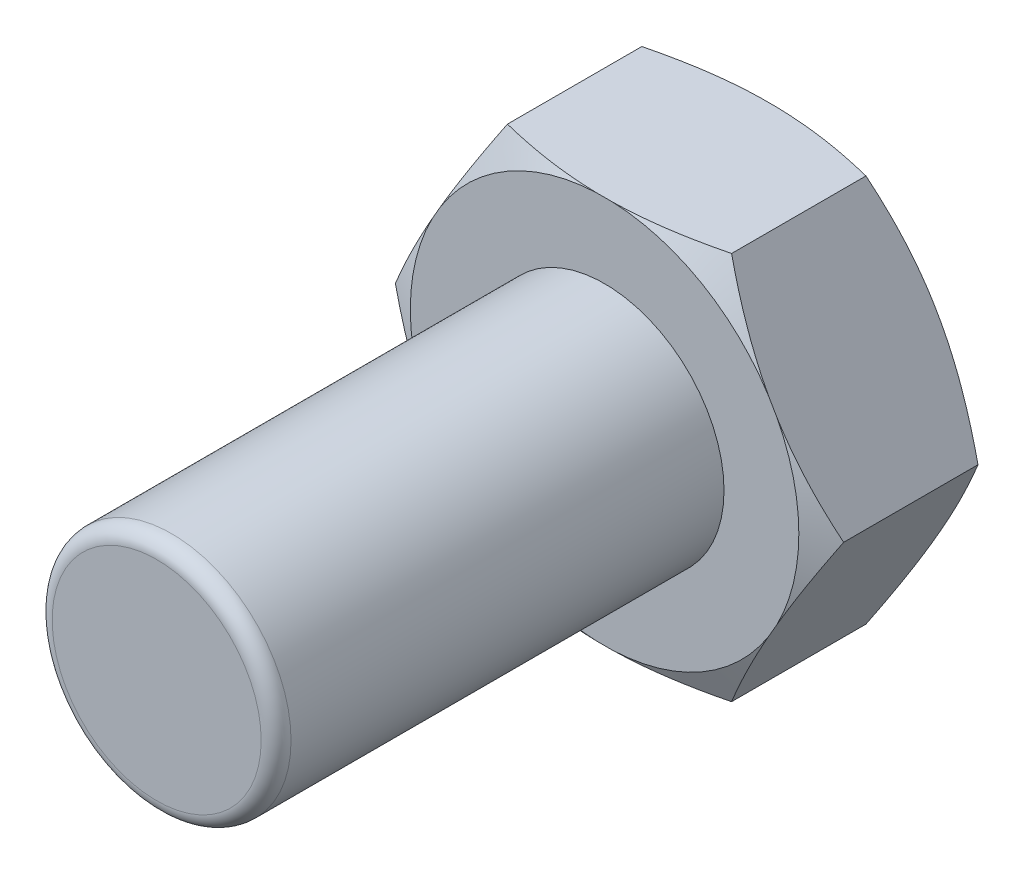
ISO-10303-21;
HEADER;
FILE_DESCRIPTION(('STEP AP214'),'2;1');
FILE_NAME('part.step','',(''),(''),'','','');
FILE_SCHEMA(('AUTOMOTIVE_DESIGN { 1 0 10303 214 1 1 1 1 }'));
ENDSEC;
DATA;
#1=APPLICATION_CONTEXT('core data for automotive mechanical design processes');
#2=APPLICATION_PROTOCOL_DEFINITION('international standard','automotive_design',2000,#1);
#3=PRODUCT_CONTEXT('',#1,'mechanical');
#4=PRODUCT('Part','Part','',(#3));
#5=PRODUCT_RELATED_PRODUCT_CATEGORY('part','',(#4));
#6=PRODUCT_DEFINITION_FORMATION('','',#4);
#7=PRODUCT_DEFINITION_CONTEXT('part definition',#1,'design');
#8=PRODUCT_DEFINITION('design','',#6,#7);
#9=PRODUCT_DEFINITION_SHAPE('','',#8);
#10=(LENGTH_UNIT() NAMED_UNIT(*) SI_UNIT(.MILLI.,.METRE.));
#11=(NAMED_UNIT(*) PLANE_ANGLE_UNIT() SI_UNIT($,.RADIAN.));
#12=(NAMED_UNIT(*) SI_UNIT($,.STERADIAN.) SOLID_ANGLE_UNIT());
#13=UNCERTAINTY_MEASURE_WITH_UNIT(LENGTH_MEASURE(1.E-05),#10,'distance_accuracy_value','');
#14=(GEOMETRIC_REPRESENTATION_CONTEXT(3) GLOBAL_UNCERTAINTY_ASSIGNED_CONTEXT((#13)) GLOBAL_UNIT_ASSIGNED_CONTEXT((#10,
#11,#12)) REPRESENTATION_CONTEXT('',''));
#15=CARTESIAN_POINT('',(0.,0.,0.));
#16=DIRECTION('',(0.,0.,1.));
#17=DIRECTION('',(1.,0.,0.));
#18=AXIS2_PLACEMENT_3D('',#15,#16,#17);
#19=CARTESIAN_POINT('',(0.,0.,5.5));
#20=DIRECTION('',(0.,0.,1.));
#21=DIRECTION('',(1.,0.,0.));
#22=AXIS2_PLACEMENT_3D('',#19,#20,#21);
#23=PLANE('',#22);
#24=CARTESIAN_POINT('',(0.,0.,5.5));
#25=DIRECTION('',(0.,0.,1.));
#26=DIRECTION('',(1.,0.,0.));
#27=AXIS2_PLACEMENT_3D('',#24,#25,#26);
#28=CIRCLE('',#27,4.);
#29=CARTESIAN_POINT('',(4.,0.,5.5));
#30=VERTEX_POINT('',#29);
#31=EDGE_CURVE('E219',#30,#30,#28,.T.);
#32=ORIENTED_EDGE('',*,*,#31,.F.);
#33=EDGE_LOOP('',(#32));
#34=FACE_BOUND('',#33,.T.);
#35=CARTESIAN_POINT('',(0.,0.,5.5));
#36=DIRECTION('',(0.,0.,1.));
#37=DIRECTION('',(1.,0.,0.));
#38=AXIS2_PLACEMENT_3D('',#35,#36,#37);
#39=CIRCLE('',#38,6.50555349946514);
#40=CARTESIAN_POINT('',(5.49479033678218,-3.48274395975477,5.5));
#41=VERTEX_POINT('',#40);
#42=CARTESIAN_POINT('',(0.268749575633286,-6.5,5.5));
#43=VERTEX_POINT('',#42);
#44=EDGE_CURVE('E226',#41,#43,#39,.F.);
#45=ORIENTED_EDGE('',*,*,#44,.F.);
#46=DIRECTION('',(0.5,0.866025403784439,0.));
#47=VECTOR('',#46,1.);
#48=CARTESIAN_POINT('',(3.75277674973257,-6.5,5.5));
#49=LINE('',#48,#47);
#50=CARTESIAN_POINT('',(5.76353991241553,-3.01725604024523,5.5));
#51=VERTEX_POINT('',#50);
#52=EDGE_CURVE('E202',#41,#51,#49,.T.);
#53=ORIENTED_EDGE('',*,*,#52,.T.);
#54=CARTESIAN_POINT('',(5.76353991241553,3.01725604024522,5.5));
#55=VERTEX_POINT('',#54);
#56=EDGE_CURVE('E224',#55,#51,#39,.F.);
#57=ORIENTED_EDGE('',*,*,#56,.F.);
#58=DIRECTION('',(-0.5,0.866025403784439,0.));
#59=VECTOR('',#58,1.);
#60=CARTESIAN_POINT('',(7.50555349946513,0.,5.5));
#61=LINE('',#60,#59);
#62=CARTESIAN_POINT('',(5.49479033678217,3.48274395975478,5.5));
#63=VERTEX_POINT('',#62);
#64=EDGE_CURVE('E257',#55,#63,#61,.T.);
#65=ORIENTED_EDGE('',*,*,#64,.T.);
#66=CARTESIAN_POINT('',(0.268749575633261,6.5,5.5));
#67=VERTEX_POINT('',#66);
#68=EDGE_CURVE('E225',#67,#63,#39,.F.);
#69=ORIENTED_EDGE('',*,*,#68,.F.);
#70=DIRECTION('',(-1.,0.,0.));
#71=VECTOR('',#70,1.);
#72=CARTESIAN_POINT('',(3.75277674973256,6.5,5.5));
#73=LINE('',#72,#71);
#74=CARTESIAN_POINT('',(-0.268749575633261,6.5,5.5));
#75=VERTEX_POINT('',#74);
#76=EDGE_CURVE('E263',#67,#75,#73,.T.);
#77=ORIENTED_EDGE('',*,*,#76,.T.);
#78=CARTESIAN_POINT('',(-5.4947903367822,3.48274395975472,5.5));
#79=VERTEX_POINT('',#78);
#80=EDGE_CURVE('E236',#79,#75,#39,.F.);
#81=ORIENTED_EDGE('',*,*,#80,.F.);
#82=DIRECTION('',(-0.5,-0.866025403784439,0.));
#83=VECTOR('',#82,1.);
#84=CARTESIAN_POINT('',(-3.75277674973257,6.5,5.5));
#85=LINE('',#84,#83);
#86=CARTESIAN_POINT('',(-5.7635399124155,3.01725604024527,5.5));
#87=VERTEX_POINT('',#86);
#88=EDGE_CURVE('E265',#79,#87,#85,.T.);
#89=ORIENTED_EDGE('',*,*,#88,.T.);
#90=CARTESIAN_POINT('',(-5.76353991241548,-3.01725604024531,5.5));
#91=VERTEX_POINT('',#90);
#92=EDGE_CURVE('E234',#91,#87,#39,.F.);
#93=ORIENTED_EDGE('',*,*,#92,.F.);
#94=DIRECTION('',(0.5,-0.866025403784438,0.));
#95=VECTOR('',#94,1.);
#96=CARTESIAN_POINT('',(-7.50555349946514,0.,5.5));
#97=LINE('',#96,#95);
#98=CARTESIAN_POINT('',(-5.49479033678222,-3.48274395975469,5.5));
#99=VERTEX_POINT('',#98);
#100=EDGE_CURVE('E272',#91,#99,#97,.T.);
#101=ORIENTED_EDGE('',*,*,#100,.T.);
#102=CARTESIAN_POINT('',(-0.268749575633286,-6.5,5.5));
#103=VERTEX_POINT('',#102);
#104=EDGE_CURVE('E230',#103,#99,#39,.F.);
#105=ORIENTED_EDGE('',*,*,#104,.F.);
#106=DIRECTION('',(1.,0.,0.));
#107=VECTOR('',#106,1.);
#108=CARTESIAN_POINT('',(-3.75277674973257,-6.5,5.5));
#109=LINE('',#108,#107);
#110=EDGE_CURVE('E207',#103,#43,#109,.T.);
#111=ORIENTED_EDGE('',*,*,#110,.T.);
#112=EDGE_LOOP('',(#45,#53,#57,#65,#69,#77,#81,#89,#93,#101,#105,#111));
#113=FACE_BOUND('',#112,.T.);
#114=ADVANCED_FACE('F38',(#34,#113),#23,.T.);
#115=CARTESIAN_POINT('',(0.,0.,0.));
#116=DIRECTION('',(0.,0.,1.));
#117=DIRECTION('',(1.,0.,0.));
#118=AXIS2_PLACEMENT_3D('',#115,#116,#117);
#119=PLANE('',#118);
#120=DIRECTION('',(0.5,0.866025403784439,0.));
#121=VECTOR('',#120,1.);
#122=CARTESIAN_POINT('',(3.75277674973257,-6.5,0.));
#123=LINE('',#122,#121);
#124=CARTESIAN_POINT('',(5.49479033678218,-3.48274395975477,0.));
#125=VERTEX_POINT('',#124);
#126=CARTESIAN_POINT('',(5.76353991241553,-3.01725604024523,0.));
#127=VERTEX_POINT('',#126);
#128=EDGE_CURVE('E277',#125,#127,#123,.T.);
#129=ORIENTED_EDGE('',*,*,#128,.F.);
#130=CARTESIAN_POINT('',(0.,0.,0.));
#131=DIRECTION('',(0.,0.,1.));
#132=DIRECTION('',(1.,0.,0.));
#133=AXIS2_PLACEMENT_3D('',#130,#131,#132);
#134=CIRCLE('',#133,6.50555349946514);
#135=CARTESIAN_POINT('',(0.268749575633286,-6.5,0.));
#136=VERTEX_POINT('',#135);
#137=EDGE_CURVE('E223',#125,#136,#134,.F.);
#138=ORIENTED_EDGE('',*,*,#137,.T.);
#139=DIRECTION('',(1.,0.,0.));
#140=VECTOR('',#139,1.);
#141=CARTESIAN_POINT('',(-3.75277674973257,-6.5,0.));
#142=LINE('',#141,#140);
#143=CARTESIAN_POINT('',(-0.268749575633286,-6.5,0.));
#144=VERTEX_POINT('',#143);
#145=EDGE_CURVE('E194',#144,#136,#142,.T.);
#146=ORIENTED_EDGE('',*,*,#145,.F.);
#147=CARTESIAN_POINT('',(-5.49479033678222,-3.48274395975469,0.));
#148=VERTEX_POINT('',#147);
#149=EDGE_CURVE('E595',#144,#148,#134,.F.);
#150=ORIENTED_EDGE('',*,*,#149,.T.);
#151=DIRECTION('',(0.5,-0.866025403784438,0.));
#152=VECTOR('',#151,1.);
#153=CARTESIAN_POINT('',(-7.50555349946514,0.,0.));
#154=LINE('',#153,#152);
#155=CARTESIAN_POINT('',(-5.76353991241548,-3.01725604024531,0.));
#156=VERTEX_POINT('',#155);
#157=EDGE_CURVE('E190',#156,#148,#154,.T.);
#158=ORIENTED_EDGE('',*,*,#157,.F.);
#159=CARTESIAN_POINT('',(-5.7635399124155,3.01725604024527,0.));
#160=VERTEX_POINT('',#159);
#161=EDGE_CURVE('E172',#156,#160,#134,.F.);
#162=ORIENTED_EDGE('',*,*,#161,.T.);
#163=DIRECTION('',(-0.5,-0.866025403784439,0.));
#164=VECTOR('',#163,1.);
#165=CARTESIAN_POINT('',(-3.75277674973257,6.5,0.));
#166=LINE('',#165,#164);
#167=CARTESIAN_POINT('',(-5.4947903367822,3.48274395975472,0.));
#168=VERTEX_POINT('',#167);
#169=EDGE_CURVE('E180',#168,#160,#166,.T.);
#170=ORIENTED_EDGE('',*,*,#169,.F.);
#171=CARTESIAN_POINT('',(-0.268749575633261,6.5,0.));
#172=VERTEX_POINT('',#171);
#173=EDGE_CURVE('E162',#168,#172,#134,.F.);
#174=ORIENTED_EDGE('',*,*,#173,.T.);
#175=DIRECTION('',(-1.,0.,0.));
#176=VECTOR('',#175,1.);
#177=CARTESIAN_POINT('',(3.75277674973256,6.5,0.));
#178=LINE('',#177,#176);
#179=CARTESIAN_POINT('',(0.268749575633261,6.5,0.));
#180=VERTEX_POINT('',#179);
#181=EDGE_CURVE('E191',#180,#172,#178,.T.);
#182=ORIENTED_EDGE('',*,*,#181,.F.);
#183=CARTESIAN_POINT('',(5.49479033678217,3.48274395975478,0.));
#184=VERTEX_POINT('',#183);
#185=EDGE_CURVE('E173',#180,#184,#134,.F.);
#186=ORIENTED_EDGE('',*,*,#185,.T.);
#187=DIRECTION('',(-0.5,0.866025403784439,0.));
#188=VECTOR('',#187,1.);
#189=CARTESIAN_POINT('',(7.50555349946513,0.,0.));
#190=LINE('',#189,#188);
#191=CARTESIAN_POINT('',(5.76353991241553,3.01725604024522,0.));
#192=VERTEX_POINT('',#191);
#193=EDGE_CURVE('E196',#192,#184,#190,.T.);
#194=ORIENTED_EDGE('',*,*,#193,.F.);
#195=EDGE_CURVE('E220',#192,#127,#134,.F.);
#196=ORIENTED_EDGE('',*,*,#195,.T.);
#197=EDGE_LOOP('',(#129,#138,#146,#150,#158,#162,#170,#174,#182,#186,#194,#196));
#198=FACE_BOUND('',#197,.T.);
#199=ADVANCED_FACE('F188',(#198),#119,.F.);
#200=CARTESIAN_POINT('',(3.75277674973257,-6.5,5.5));
#201=DIRECTION('',(-0.866025403784439,0.5,0.));
#202=DIRECTION('',(-0.5,-0.866025403784439,0.));
#203=AXIS2_PLACEMENT_3D('',#200,#201,#202);
#204=PLANE('',#203);
#205=DIRECTION('',(0.,0.,-1.));
#206=VECTOR('',#205,1.);
#207=CARTESIAN_POINT('',(3.75277674973257,-6.5,5.5));
#208=LINE('',#207,#206);
#209=CARTESIAN_POINT('',(3.75277674973257,-6.5,5.));
#210=VERTEX_POINT('',#209);
#211=CARTESIAN_POINT('',(3.75277674973257,-6.5,0.5));
#212=VERTEX_POINT('',#211);
#213=EDGE_CURVE('E203',#210,#212,#208,.T.);
#214=ORIENTED_EDGE('',*,*,#213,.T.);
#215=CARTESIAN_POINT('',(3.75237260454413,-6.5007,0.500202088914585));
#216=CARTESIAN_POINT('',(3.8581513468533,-6.3174858439598,0.447308100414797));
#217=CARTESIAN_POINT('',(3.96434221026252,-6.13355787323541,0.397552458642436));
#218=CARTESIAN_POINT('',(4.17756983432187,-5.76423679478743,0.305365614830753));
#219=CARTESIAN_POINT('',(4.28460700117574,-5.57884298349829,0.262938185371068));
#220=CARTESIAN_POINT('',(4.49959934134498,-5.20646532708704,0.186455410870334));
#221=CARTESIAN_POINT('',(4.60755563959989,-5.01947953351247,0.152412559968943));
#222=CARTESIAN_POINT('',(4.82409838792355,-4.6444164914053,0.0938297029314832));
#223=CARTESIAN_POINT('',(4.93268472608622,-4.4563394366997,0.0692880586741505));
#224=CARTESIAN_POINT('',(5.1478553862202,-4.0836529210495,0.031003092263815));
#225=CARTESIAN_POINT('',(5.25442927124948,-3.89906153741879,0.0170275284853245));
#226=CARTESIAN_POINT('',(5.4677990566594,-3.52949422828874,-0.000510400439065489));
#227=CARTESIAN_POINT('',(5.57459496772756,-3.34451828427808,-0.00407225212184421));
#228=CARTESIAN_POINT('',(5.78802860217816,-2.97484038536555,-0.000644602363145451));
#229=CARTESIAN_POINT('',(5.8946663719813,-2.79013835006069,0.00633352888495326));
#230=CARTESIAN_POINT('',(6.10763808623,-2.42126052040688,0.0305511734218139));
#231=CARTESIAN_POINT('',(6.21397205579703,-2.23708468254632,0.0477898120447853));
#232=CARTESIAN_POINT('',(6.41948815126255,-1.88112036342686,0.0905216057624534));
#233=CARTESIAN_POINT('',(6.5187011062663,-1.70927848459131,0.11543017165032));
#234=CARTESIAN_POINT('',(6.71656951926134,-1.36656034007088,0.173005823171236));
#235=CARTESIAN_POINT('',(6.81522491642766,-1.19568417973793,0.205673739175031));
#236=CARTESIAN_POINT('',(7.01298812041286,-0.853148262567952,0.278357612028755));
#237=CARTESIAN_POINT('',(7.11208869539026,-0.681501031647809,0.318451480294036));
#238=CARTESIAN_POINT('',(7.30956235262323,-0.339466624163873,0.404867578606761));
#239=CARTESIAN_POINT('',(7.40793575289547,-0.169078896779033,0.451186892347521));
#240=CARTESIAN_POINT('',(7.50595764465357,0.000700000000001562,0.500202088914583));
#241=B_SPLINE_CURVE_WITH_KNOTS('',3,(#215,#216,#217,#218,#219,#220,#221,#222,#223,#224,#225,
#226,#227,#228,#229,#230,#231,#232,#233,#234,#235,#236,#237,#238,#239,#240),.UNSPECIFIED.,.F.,
.F.,(4,2,2,2,2,2,2,2,2,2,2,2,4),(0.,0.654242187553569,1.30882018300877,1.96436776438002,
2.61980227114733,3.26037426611438,3.90097784487654,4.54089085456767,5.18074932213415,
5.78053406899308,6.38038303105972,6.98692412571604,7.59318207044967),.UNSPECIFIED.);
#242=EDGE_CURVE('E335',#212,#125,#241,.T.);
#243=ORIENTED_EDGE('',*,*,#242,.T.);
#244=ORIENTED_EDGE('',*,*,#128,.T.);
#245=CARTESIAN_POINT('',(7.50555349946514,0.,0.5));
#246=VERTEX_POINT('',#245);
#247=EDGE_CURVE('E602',#127,#246,#241,.T.);
#248=ORIENTED_EDGE('',*,*,#247,.T.);
#249=DIRECTION('',(0.,0.,-1.));
#250=VECTOR('',#249,1.);
#251=CARTESIAN_POINT('',(7.50555349946513,0.,5.5));
#252=LINE('',#251,#250);
#253=CARTESIAN_POINT('',(7.50555349946514,0.,5.));
#254=VERTEX_POINT('',#253);
#255=EDGE_CURVE('E217',#254,#246,#252,.T.);
#256=ORIENTED_EDGE('',*,*,#255,.F.);
#257=CARTESIAN_POINT('',(7.50595764465357,0.000700000000001858,4.99979791108542));
#258=CARTESIAN_POINT('',(7.4001789023444,-0.182514156040201,5.0526918995852));
#259=CARTESIAN_POINT('',(7.29398803893518,-0.366442126764588,5.10244754135756));
#260=CARTESIAN_POINT('',(7.08076041487583,-0.735763205212568,5.19463438516925));
#261=CARTESIAN_POINT('',(6.97372324802196,-0.921157016501705,5.23706181462893));
#262=CARTESIAN_POINT('',(6.75873090785272,-1.29353467291295,5.31354458912967));
#263=CARTESIAN_POINT('',(6.65077460959781,-1.48052046648752,5.34758744003106));
#264=CARTESIAN_POINT('',(6.43423186127415,-1.8555835085947,5.40617029706852));
#265=CARTESIAN_POINT('',(6.32564552311148,-2.0436605633003,5.43071194132585));
#266=CARTESIAN_POINT('',(6.1104748629775,-2.41634707895049,5.46899690773619));
#267=CARTESIAN_POINT('',(6.00390097794822,-2.6009384625812,5.48297247151467));
#268=CARTESIAN_POINT('',(5.7905311925383,-2.97050577171125,5.50051040043907));
#269=CARTESIAN_POINT('',(5.68373528147015,-3.15548171572191,5.50407225212184));
#270=CARTESIAN_POINT('',(5.47030164701954,-3.52515961463445,5.50064460236315));
#271=CARTESIAN_POINT('',(5.36366387721641,-3.70986164993931,5.49366647111505));
#272=CARTESIAN_POINT('',(5.1506921629677,-4.07873947959311,5.46944882657819));
#273=CARTESIAN_POINT('',(5.04435819340067,-4.26291531745367,5.45221018795521));
#274=CARTESIAN_POINT('',(4.83884209793515,-4.61887963657314,5.40947839423755));
#275=CARTESIAN_POINT('',(4.7396291429314,-4.79072151540868,5.38456982834968));
#276=CARTESIAN_POINT('',(4.54176072993636,-5.13343965992911,5.32699417682876));
#277=CARTESIAN_POINT('',(4.44310533277004,-5.30431582026207,5.29432626082497));
#278=CARTESIAN_POINT('',(4.24534212878484,-5.64685173743205,5.22164238797124));
#279=CARTESIAN_POINT('',(4.14624155380744,-5.81849896835219,5.18154851970596));
#280=CARTESIAN_POINT('',(3.94876789657447,-6.16053337583612,5.09513242139324));
#281=CARTESIAN_POINT('',(3.85039449630223,-6.33092110322097,5.04881310765248));
#282=CARTESIAN_POINT('',(3.75237260454413,-6.5007,4.99979791108542));
#283=B_SPLINE_CURVE_WITH_KNOTS('',3,(#257,#258,#259,#260,#261,#262,#263,#264,#265,#266,#267,
#268,#269,#270,#271,#272,#273,#274,#275,#276,#277,#278,#279,#280,#281,#282),.UNSPECIFIED.,.F.,
.F.,(4,2,2,2,2,2,2,2,2,2,2,2,4),(0.,0.654242187553568,1.30882018300877,1.96436776438002,
2.61980227114733,3.26037426611438,3.90097784487653,4.54089085456766,5.18074932213414,
5.78053406899307,6.38038303105972,6.98692412571604,7.59318207044967),.UNSPECIFIED.);
#284=EDGE_CURVE('E279',#254,#51,#283,.T.);
#285=ORIENTED_EDGE('',*,*,#284,.T.);
#286=ORIENTED_EDGE('',*,*,#52,.F.);
#287=EDGE_CURVE('E371',#41,#210,#283,.T.);
#288=ORIENTED_EDGE('',*,*,#287,.T.);
#289=EDGE_LOOP('',(#214,#243,#244,#248,#256,#285,#286,#288));
#290=FACE_BOUND('',#289,.T.);
#291=ADVANCED_FACE('F384',(#290),#204,.F.);
#292=CARTESIAN_POINT('',(7.50555349946513,0.,5.5));
#293=DIRECTION('',(-0.866025403784439,-0.5,0.));
#294=DIRECTION('',(0.5,-0.866025403784439,0.));
#295=AXIS2_PLACEMENT_3D('',#292,#293,#294);
#296=PLANE('',#295);
#297=ORIENTED_EDGE('',*,*,#255,.T.);
#298=CARTESIAN_POINT('',(7.50595764465356,-0.00069999999999797,0.500202088914583));
#299=CARTESIAN_POINT('',(7.4001789023444,0.182514156040205,0.447308100414796));
#300=CARTESIAN_POINT('',(7.29398803893518,0.366442126764592,0.397552458642435));
#301=CARTESIAN_POINT('',(7.08076041487583,0.735763205212573,0.305365614830752));
#302=CARTESIAN_POINT('',(6.97372324802196,0.921157016501709,0.262938185371066));
#303=CARTESIAN_POINT('',(6.75873090785272,1.29353467291296,0.186455410870333));
#304=CARTESIAN_POINT('',(6.65077460959781,1.48052046648753,0.152412559968942));
#305=CARTESIAN_POINT('',(6.43423186127415,1.85558350859471,0.0938297029314831));
#306=CARTESIAN_POINT('',(6.32564552311148,2.0436605633003,0.0692880586741502));
#307=CARTESIAN_POINT('',(6.1104748629775,2.4163470789505,0.0310030922638145));
#308=CARTESIAN_POINT('',(6.00390097794822,2.60093846258121,0.0170275284853243));
#309=CARTESIAN_POINT('',(5.7905311925383,2.97050577171126,-0.000510400439065394));
#310=CARTESIAN_POINT('',(5.68373528147014,3.15548171572192,-0.00407225212184394));
#311=CARTESIAN_POINT('',(5.47030164701954,3.52515961463445,-0.000644602363145258));
#312=CARTESIAN_POINT('',(5.3636638772164,3.70986164993931,0.00633352888495324));
#313=CARTESIAN_POINT('',(5.15069216296769,4.07873947959312,0.0305511734218142));
#314=CARTESIAN_POINT('',(5.04435819340067,4.26291531745368,0.0477898120447861));
#315=CARTESIAN_POINT('',(4.83884209793515,4.61887963657314,0.0905216057624544));
#316=CARTESIAN_POINT('',(4.7396291429314,4.79072151540869,0.115430171650321));
#317=CARTESIAN_POINT('',(4.54176072993636,5.13343965992912,0.173005823171237));
#318=CARTESIAN_POINT('',(4.44310533277004,5.30431582026207,0.205673739175032));
#319=CARTESIAN_POINT('',(4.24534212878483,5.64685173743205,0.278357612028756));
#320=CARTESIAN_POINT('',(4.14624155380744,5.81849896835219,0.318451480294037));
#321=CARTESIAN_POINT('',(3.94876789657447,6.16053337583613,0.404867578606762));
#322=CARTESIAN_POINT('',(3.85039449630223,6.33092110322097,0.451186892347522));
#323=CARTESIAN_POINT('',(3.75237260454413,6.5007,0.500202088914585));
#324=B_SPLINE_CURVE_WITH_KNOTS('',3,(#298,#299,#300,#301,#302,#303,#304,#305,#306,#307,#308,
#309,#310,#311,#312,#313,#314,#315,#316,#317,#318,#319,#320,#321,#322,#323),.UNSPECIFIED.,.F.,
.F.,(4,2,2,2,2,2,2,2,2,2,2,2,4),(0.,0.654242187553569,1.30882018300877,1.96436776438002,
2.61980227114733,3.26037426611438,3.90097784487654,4.54089085456767,5.18074932213415,
5.78053406899307,6.38038303105972,6.98692412571604,7.59318207044967),.UNSPECIFIED.);
#325=EDGE_CURVE('E284',#246,#192,#324,.T.);
#326=ORIENTED_EDGE('',*,*,#325,.T.);
#327=ORIENTED_EDGE('',*,*,#193,.T.);
#328=CARTESIAN_POINT('',(3.75277674973257,6.5,0.5));
#329=VERTEX_POINT('',#328);
#330=EDGE_CURVE('E283',#184,#329,#324,.T.);
#331=ORIENTED_EDGE('',*,*,#330,.T.);
#332=DIRECTION('',(0.,0.,-1.));
#333=VECTOR('',#332,1.);
#334=CARTESIAN_POINT('',(3.75277674973256,6.5,5.5));
#335=LINE('',#334,#333);
#336=CARTESIAN_POINT('',(3.75277674973257,6.5,5.));
#337=VERTEX_POINT('',#336);
#338=EDGE_CURVE('E214',#337,#329,#335,.T.);
#339=ORIENTED_EDGE('',*,*,#338,.F.);
#340=CARTESIAN_POINT('',(3.75237260454413,6.5007,4.99979791108542));
#341=CARTESIAN_POINT('',(3.85815134685329,6.3174858439598,5.0526918995852));
#342=CARTESIAN_POINT('',(3.96434221026252,6.13355787323541,5.10244754135756));
#343=CARTESIAN_POINT('',(4.17756983432187,5.76423679478743,5.19463438516925));
#344=CARTESIAN_POINT('',(4.28460700117574,5.57884298349829,5.23706181462893));
#345=CARTESIAN_POINT('',(4.49959934134498,5.20646532708704,5.31354458912967));
#346=CARTESIAN_POINT('',(4.60755563959989,5.01947953351247,5.34758744003106));
#347=CARTESIAN_POINT('',(4.82409838792355,4.6444164914053,5.40617029706852));
#348=CARTESIAN_POINT('',(4.93268472608622,4.4563394366997,5.43071194132585));
#349=CARTESIAN_POINT('',(5.1478553862202,4.08365292104951,5.46899690773619));
#350=CARTESIAN_POINT('',(5.25442927124948,3.89906153741879,5.48297247151467));
#351=CARTESIAN_POINT('',(5.4677990566594,3.52949422828874,5.50051040043907));
#352=CARTESIAN_POINT('',(5.57459496772755,3.34451828427809,5.50407225212184));
#353=CARTESIAN_POINT('',(5.78802860217816,2.97484038536555,5.50064460236315));
#354=CARTESIAN_POINT('',(5.8946663719813,2.79013835006069,5.49366647111505));
#355=CARTESIAN_POINT('',(6.10763808623,2.42126052040689,5.46944882657819));
#356=CARTESIAN_POINT('',(6.21397205579703,2.23708468254632,5.45221018795521));
#357=CARTESIAN_POINT('',(6.41948815126255,1.88112036342686,5.40947839423755));
#358=CARTESIAN_POINT('',(6.5187011062663,1.70927848459132,5.38456982834968));
#359=CARTESIAN_POINT('',(6.71656951926134,1.36656034007089,5.32699417682876));
#360=CARTESIAN_POINT('',(6.81522491642766,1.19568417973793,5.29432626082497));
#361=CARTESIAN_POINT('',(7.01298812041286,0.853148262567956,5.22164238797124));
#362=CARTESIAN_POINT('',(7.11208869539026,0.681501031647813,5.18154851970596));
#363=CARTESIAN_POINT('',(7.30956235262322,0.339466624163877,5.09513242139324));
#364=CARTESIAN_POINT('',(7.40793575289547,0.169078896779037,5.04881310765248));
#365=CARTESIAN_POINT('',(7.50595764465356,-0.000699999999997427,4.99979791108542));
#366=B_SPLINE_CURVE_WITH_KNOTS('',3,(#340,#341,#342,#343,#344,#345,#346,#347,#348,#349,#350,
#351,#352,#353,#354,#355,#356,#357,#358,#359,#360,#361,#362,#363,#364,#365),.UNSPECIFIED.,.F.,
.F.,(4,2,2,2,2,2,2,2,2,2,2,2,4),(0.,0.65424218755357,1.30882018300877,1.96436776438002,
2.61980227114733,3.26037426611438,3.90097784487654,4.54089085456767,5.18074932213415,
5.78053406899307,6.38038303105972,6.98692412571604,7.59318207044967),.UNSPECIFIED.);
#367=EDGE_CURVE('E245',#337,#63,#366,.T.);
#368=ORIENTED_EDGE('',*,*,#367,.T.);
#369=ORIENTED_EDGE('',*,*,#64,.F.);
#370=EDGE_CURVE('E259',#55,#254,#366,.T.);
#371=ORIENTED_EDGE('',*,*,#370,.T.);
#372=EDGE_LOOP('',(#297,#326,#327,#331,#339,#368,#369,#371));
#373=FACE_BOUND('',#372,.T.);
#374=ADVANCED_FACE('F255',(#373),#296,.F.);
#375=CARTESIAN_POINT('',(3.75277674973256,6.5,5.5));
#376=DIRECTION('',(0.,-1.,0.));
#377=DIRECTION('',(0.,0.,-1.));
#378=AXIS2_PLACEMENT_3D('',#375,#376,#377);
#379=PLANE('',#378);
#380=ORIENTED_EDGE('',*,*,#338,.T.);
#381=CARTESIAN_POINT('',(3.75347674973256,6.5,0.500175012240365));
#382=CARTESIAN_POINT('',(3.54192162519923,6.5,0.447282755969558));
#383=CARTESIAN_POINT('',(3.32954227379659,6.5,0.397528857024414));
#384=CARTESIAN_POINT('',(2.90309182650538,6.5,0.305345485202523));
#385=CARTESIAN_POINT('',(2.68901991825973,6.5,0.262919784770842));
#386=CARTESIAN_POINT('',(2.25904019363984,6.5,0.186440425956892));
#387=CARTESIAN_POINT('',(2.04313012776865,6.5,0.152399260005533));
#388=CARTESIAN_POINT('',(1.6100497632385,6.5,0.0938196616704836));
#389=CARTESIAN_POINT('',(1.39287968837432,6.5,0.0692795912208281));
#390=CARTESIAN_POINT('',(0.962543417507529,6.5,0.0309975490733606));
#391=CARTESIAN_POINT('',(0.749398092974236,6.5,0.0170233475587274));
#392=CARTESIAN_POINT('',(0.322663478736452,6.5,-0.000512066325803271));
#393=CARTESIAN_POINT('',(0.109074167659224,6.5,-0.00407276522012902));
#394=CARTESIAN_POINT('',(-0.31778804759895,6.5,-0.000643068305750199));
#395=CARTESIAN_POINT('',(-0.531061044668984,6.5,0.00633595837845697));
#396=CARTESIAN_POINT('',(-0.95699936095713,6.5,0.0305551115069941));
#397=CARTESIAN_POINT('',(-1.16966473042201,6.5,0.0477943632817789));
#398=CARTESIAN_POINT('',(-1.58068117508018,6.5,0.0905259486290271));
#399=CARTESIAN_POINT('',(-1.77909395716747,6.5,0.115433252203116));
#400=CARTESIAN_POINT('',(-2.17480466284762,6.5,0.173005342178703));
#401=CARTESIAN_POINT('',(-2.3721024648757,6.5,0.205670958367692));
#402=CARTESIAN_POINT('',(-2.76760272502698,6.5,0.278349291876491));
#403=CARTESIAN_POINT('',(-2.96579072274422,6.5,0.318439903827291));
#404=CARTESIAN_POINT('',(-3.360711947741,6.5,0.404848758409281));
#405=CARTESIAN_POINT('',(-3.5574458108006,6.5,0.451164085844501));
#406=CARTESIAN_POINT('',(-3.75347674973257,6.5,0.500175012240366));
#407=B_SPLINE_CURVE_WITH_KNOTS('',3,(#381,#382,#383,#384,#385,#386,#387,#388,#389,#390,#391,
#392,#393,#394,#395,#396,#397,#398,#399,#400,#401,#402,#403,#404,#405,#406),.UNSPECIFIED.,.F.,
.F.,(4,2,2,2,2,2,2,2,2,2,2,2,4),(0.,0.654234056420655,1.30880390529539,1.96434320152268,
2.61976942707328,3.26033383975563,3.9009298372606,4.54083532196571,5.18068626345358,
5.78043149769994,6.38024090638788,6.98674140943669,7.5929588559283),.UNSPECIFIED.);
#408=EDGE_CURVE('E289',#329,#180,#407,.T.);
#409=ORIENTED_EDGE('',*,*,#408,.T.);
#410=ORIENTED_EDGE('',*,*,#181,.T.);
#411=CARTESIAN_POINT('',(-3.75277674973257,6.5,0.5));
#412=VERTEX_POINT('',#411);
#413=EDGE_CURVE('E167',#172,#412,#407,.T.);
#414=ORIENTED_EDGE('',*,*,#413,.T.);
#415=DIRECTION('',(0.,0.,-1.));
#416=VECTOR('',#415,1.);
#417=CARTESIAN_POINT('',(-3.75277674973257,6.5,5.5));
#418=LINE('',#417,#416);
#419=CARTESIAN_POINT('',(-3.75277674973257,6.5,5.));
#420=VERTEX_POINT('',#419);
#421=EDGE_CURVE('E183',#420,#412,#418,.T.);
#422=ORIENTED_EDGE('',*,*,#421,.F.);
#423=CARTESIAN_POINT('',(-3.75347674973257,6.5,4.99982498775963));
#424=CARTESIAN_POINT('',(-3.54192162519923,6.5,5.05271724403044));
#425=CARTESIAN_POINT('',(-3.32954227379659,6.5,5.10247114297559));
#426=CARTESIAN_POINT('',(-2.90309182650538,6.5,5.19465451479748));
#427=CARTESIAN_POINT('',(-2.68901991825973,6.5,5.23708021522916));
#428=CARTESIAN_POINT('',(-2.25904019363984,6.5,5.31355957404311));
#429=CARTESIAN_POINT('',(-2.04313012776865,6.5,5.34760073999447));
#430=CARTESIAN_POINT('',(-1.61004976323851,6.5,5.40618033832952));
#431=CARTESIAN_POINT('',(-1.39287968837432,6.5,5.43072040877917));
#432=CARTESIAN_POINT('',(-0.962543417507533,6.5,5.46900245092664));
#433=CARTESIAN_POINT('',(-0.749398092974241,6.5,5.48297665244127));
#434=CARTESIAN_POINT('',(-0.322663478736457,6.5,5.5005120663258));
#435=CARTESIAN_POINT('',(-0.10907416765923,6.5,5.50407276522013));
#436=CARTESIAN_POINT('',(0.317788047598944,6.5,5.50064306830575));
#437=CARTESIAN_POINT('',(0.531061044668979,6.5,5.49366404162154));
#438=CARTESIAN_POINT('',(0.956999360957123,6.5,5.46944488849301));
#439=CARTESIAN_POINT('',(1.16966473042201,6.5,5.45220563671822));
#440=CARTESIAN_POINT('',(1.58068117508018,6.5,5.40947405137097));
#441=CARTESIAN_POINT('',(1.77909395716747,6.5,5.38456674779688));
#442=CARTESIAN_POINT('',(2.17480466284761,6.5,5.3269946578213));
#443=CARTESIAN_POINT('',(2.3721024648757,6.5,5.29432904163231));
#444=CARTESIAN_POINT('',(2.76760272502698,6.5,5.22165070812351));
#445=CARTESIAN_POINT('',(2.96579072274422,6.5,5.18156009617271));
#446=CARTESIAN_POINT('',(3.360711947741,6.5,5.09515124159072));
#447=CARTESIAN_POINT('',(3.55744581080059,6.5,5.0488359141555));
#448=CARTESIAN_POINT('',(3.75347674973256,6.5,4.99982498775963));
#449=B_SPLINE_CURVE_WITH_KNOTS('',3,(#423,#424,#425,#426,#427,#428,#429,#430,#431,#432,#433,
#434,#435,#436,#437,#438,#439,#440,#441,#442,#443,#444,#445,#446,#447,#448),.UNSPECIFIED.,.F.,
.F.,(4,2,2,2,2,2,2,2,2,2,2,2,4),(0.,0.654234056420655,1.30880390529539,1.96434320152268,
2.61976942707328,3.26033383975563,3.9009298372606,4.54083532196571,5.18068626345358,
5.78043149769993,6.38024090638788,6.98674140943668,7.5929588559283),.UNSPECIFIED.);
#450=EDGE_CURVE('E396',#420,#75,#449,.T.);
#451=ORIENTED_EDGE('',*,*,#450,.T.);
#452=ORIENTED_EDGE('',*,*,#76,.F.);
#453=EDGE_CURVE('E247',#67,#337,#449,.T.);
#454=ORIENTED_EDGE('',*,*,#453,.T.);
#455=EDGE_LOOP('',(#380,#409,#410,#414,#422,#451,#452,#454));
#456=FACE_BOUND('',#455,.T.);
#457=ADVANCED_FACE('F291',(#456),#379,.F.);
#458=CARTESIAN_POINT('',(-3.75277674973257,6.5,5.5));
#459=DIRECTION('',(0.866025403784439,-0.5,0.));
#460=DIRECTION('',(0.5,0.866025403784439,0.));
#461=AXIS2_PLACEMENT_3D('',#458,#459,#460);
#462=PLANE('',#461);
#463=ORIENTED_EDGE('',*,*,#421,.T.);
#464=CARTESIAN_POINT('',(-3.75237260454414,6.5007,0.500202088914585));
#465=CARTESIAN_POINT('',(-3.8581513468533,6.3174858439598,0.447308100414798));
#466=CARTESIAN_POINT('',(-3.96434221026252,6.13355787323541,0.397552458642437));
#467=CARTESIAN_POINT('',(-4.17756983432187,5.76423679478743,0.305365614830754));
#468=CARTESIAN_POINT('',(-4.28460700117574,5.57884298349829,0.262938185371069));
#469=CARTESIAN_POINT('',(-4.49959934134498,5.20646532708704,0.186455410870335));
#470=CARTESIAN_POINT('',(-4.60755563959989,5.01947953351247,0.152412559968944));
#471=CARTESIAN_POINT('',(-4.82409838792355,4.6444164914053,0.0938297029314844));
#472=CARTESIAN_POINT('',(-4.93268472608622,4.4563394366997,0.069288058674152));
#473=CARTESIAN_POINT('',(-5.1478553862202,4.08365292104951,0.0310030922638162));
#474=CARTESIAN_POINT('',(-5.25442927124948,3.89906153741879,0.0170275284853252));
#475=CARTESIAN_POINT('',(-5.4677990566594,3.52949422828874,-0.000510400439064884));
#476=CARTESIAN_POINT('',(-5.57459496772756,3.34451828427809,-0.00407225212184326));
#477=CARTESIAN_POINT('',(-5.78802860217816,2.97484038536555,-0.000644602363144531));
#478=CARTESIAN_POINT('',(-5.8946663719813,2.79013835006069,0.00633352888495383));
#479=CARTESIAN_POINT('',(-6.10763808623001,2.42126052040689,0.0305511734218144));
#480=CARTESIAN_POINT('',(-6.21397205579703,2.23708468254632,0.0477898120447861));
#481=CARTESIAN_POINT('',(-6.41948815126255,1.88112036342686,0.0905216057624543));
#482=CARTESIAN_POINT('',(-6.5187011062663,1.70927848459132,0.115430171650321));
#483=CARTESIAN_POINT('',(-6.71656951926134,1.36656034007089,0.173005823171237));
#484=CARTESIAN_POINT('',(-6.81522491642766,1.19568417973793,0.205673739175032));
#485=CARTESIAN_POINT('',(-7.01298812041287,0.853148262567952,0.278357612028756));
#486=CARTESIAN_POINT('',(-7.11208869539026,0.681501031647809,0.318451480294037));
#487=CARTESIAN_POINT('',(-7.30956235262323,0.339466624163872,0.404867578606763));
#488=CARTESIAN_POINT('',(-7.40793575289548,0.169078896779031,0.451186892347523));
#489=CARTESIAN_POINT('',(-7.50595764465357,-0.000700000000003896,0.500202088914586));
#490=B_SPLINE_CURVE_WITH_KNOTS('',3,(#464,#465,#466,#467,#468,#469,#470,#471,#472,#473,#474,
#475,#476,#477,#478,#479,#480,#481,#482,#483,#484,#485,#486,#487,#488,#489),.UNSPECIFIED.,.F.,
.F.,(4,2,2,2,2,2,2,2,2,2,2,2,4),(0.,0.65424218755357,1.30882018300877,1.96436776438002,
2.61980227114733,3.26037426611438,3.90097784487654,4.54089085456767,5.18074932213415,
5.78053406899307,6.38038303105972,6.98692412571605,7.59318207044967),.UNSPECIFIED.);
#491=EDGE_CURVE('E165',#412,#168,#490,.T.);
#492=ORIENTED_EDGE('',*,*,#491,.T.);
#493=ORIENTED_EDGE('',*,*,#169,.T.);
#494=CARTESIAN_POINT('',(-7.50555349946514,0.,0.5));
#495=VERTEX_POINT('',#494);
#496=EDGE_CURVE('E184',#160,#495,#490,.T.);
#497=ORIENTED_EDGE('',*,*,#496,.T.);
#498=DIRECTION('',(0.,0.,-1.));
#499=VECTOR('',#498,1.);
#500=CARTESIAN_POINT('',(-7.50555349946514,0.,5.5));
#501=LINE('',#500,#499);
#502=CARTESIAN_POINT('',(-7.50555349946514,0.,5.));
#503=VERTEX_POINT('',#502);
#504=EDGE_CURVE('E210',#503,#495,#501,.T.);
#505=ORIENTED_EDGE('',*,*,#504,.F.);
#506=CARTESIAN_POINT('',(-7.50595764465357,-0.000700000000003274,4.99979791108541));
#507=CARTESIAN_POINT('',(-7.40017890234441,0.1825141560402,5.0526918995852));
#508=CARTESIAN_POINT('',(-7.29398803893518,0.366442126764587,5.10244754135756));
#509=CARTESIAN_POINT('',(-7.08076041487584,0.735763205212567,5.19463438516925));
#510=CARTESIAN_POINT('',(-6.97372324802196,0.921157016501703,5.23706181462893));
#511=CARTESIAN_POINT('',(-6.75873090785273,1.29353467291295,5.31354458912967));
#512=CARTESIAN_POINT('',(-6.65077460959781,1.48052046648752,5.34758744003106));
#513=CARTESIAN_POINT('',(-6.43423186127416,1.8555835085947,5.40617029706852));
#514=CARTESIAN_POINT('',(-6.32564552311149,2.0436605633003,5.43071194132585));
#515=CARTESIAN_POINT('',(-6.1104748629775,2.41634707895049,5.46899690773618));
#516=CARTESIAN_POINT('',(-6.00390097794823,2.6009384625812,5.48297247151467));
#517=CARTESIAN_POINT('',(-5.79053119253831,2.97050577171125,5.50051040043906));
#518=CARTESIAN_POINT('',(-5.68373528147015,3.15548171572191,5.50407225212184));
#519=CARTESIAN_POINT('',(-5.47030164701954,3.52515961463445,5.50064460236314));
#520=CARTESIAN_POINT('',(-5.36366387721641,3.70986164993931,5.49366647111504));
#521=CARTESIAN_POINT('',(-5.1506921629677,4.07873947959311,5.46944882657819));
#522=CARTESIAN_POINT('',(-5.04435819340068,4.26291531745367,5.45221018795521));
#523=CARTESIAN_POINT('',(-4.83884209793515,4.61887963657314,5.40947839423755));
#524=CARTESIAN_POINT('',(-4.7396291429314,4.79072151540868,5.38456982834968));
#525=CARTESIAN_POINT('',(-4.54176072993636,5.13343965992911,5.32699417682876));
#526=CARTESIAN_POINT('',(-4.44310533277004,5.30431582026207,5.29432626082497));
#527=CARTESIAN_POINT('',(-4.24534212878484,5.64685173743205,5.22164238797124));
#528=CARTESIAN_POINT('',(-4.14624155380744,5.81849896835219,5.18154851970596));
#529=CARTESIAN_POINT('',(-3.94876789657447,6.16053337583613,5.09513242139324));
#530=CARTESIAN_POINT('',(-3.85039449630223,6.33092110322097,5.04881310765248));
#531=CARTESIAN_POINT('',(-3.75237260454414,6.5007,4.99979791108541));
#532=B_SPLINE_CURVE_WITH_KNOTS('',3,(#506,#507,#508,#509,#510,#511,#512,#513,#514,#515,#516,
#517,#518,#519,#520,#521,#522,#523,#524,#525,#526,#527,#528,#529,#530,#531),.UNSPECIFIED.,.F.,
.F.,(4,2,2,2,2,2,2,2,2,2,2,2,4),(0.,0.654242187553569,1.30882018300877,1.96436776438002,
2.61980227114733,3.26037426611438,3.90097784487654,4.54089085456767,5.18074932213415,
5.78053406899307,6.38038303105972,6.98692412571605,7.59318207044967),.UNSPECIFIED.);
#533=EDGE_CURVE('E378',#503,#87,#532,.T.);
#534=ORIENTED_EDGE('',*,*,#533,.T.);
#535=ORIENTED_EDGE('',*,*,#88,.F.);
#536=EDGE_CURVE('E607',#79,#420,#532,.T.);
#537=ORIENTED_EDGE('',*,*,#536,.T.);
#538=EDGE_LOOP('',(#463,#492,#493,#497,#505,#534,#535,#537));
#539=FACE_BOUND('',#538,.T.);
#540=ADVANCED_FACE('F178',(#539),#462,.F.);
#541=CARTESIAN_POINT('',(-7.50555349946514,0.,5.5));
#542=DIRECTION('',(0.866025403784439,0.5,0.));
#543=DIRECTION('',(-0.5,0.866025403784439,0.));
#544=AXIS2_PLACEMENT_3D('',#541,#542,#543);
#545=PLANE('',#544);
#546=ORIENTED_EDGE('',*,*,#504,.T.);
#547=CARTESIAN_POINT('',(-7.50595764465357,0.000699999999996554,0.500202088914586));
#548=CARTESIAN_POINT('',(-7.40017890234441,-0.182514156040207,0.447308100414798));
#549=CARTESIAN_POINT('',(-7.29398803893518,-0.366442126764594,0.397552458642437));
#550=CARTESIAN_POINT('',(-7.08076041487584,-0.735763205212574,0.305365614830754));
#551=CARTESIAN_POINT('',(-6.97372324802196,-0.921157016501711,0.262938185371069));
#552=CARTESIAN_POINT('',(-6.75873090785273,-1.29353467291296,0.186455410870335));
#553=CARTESIAN_POINT('',(-6.65077460959781,-1.48052046648753,0.152412559968944));
#554=CARTESIAN_POINT('',(-6.43423186127415,-1.85558350859471,0.093829702931485));
#555=CARTESIAN_POINT('',(-6.32564552311149,-2.0436605633003,0.0692880586741526));
#556=CARTESIAN_POINT('',(-6.1104748629775,-2.4163470789505,0.0310030922638168));
#557=CARTESIAN_POINT('',(-6.00390097794822,-2.60093846258121,0.0170275284853259));
#558=CARTESIAN_POINT('',(-5.7905311925383,-2.97050577171126,-0.000510400439063934));
#559=CARTESIAN_POINT('',(-5.68373528147015,-3.15548171572192,-0.00407225212184203));
#560=CARTESIAN_POINT('',(-5.47030164701954,-3.52515961463445,-0.000644602363143189));
#561=CARTESIAN_POINT('',(-5.36366387721641,-3.70986164993931,0.006333528884955));
#562=CARTESIAN_POINT('',(-5.1506921629677,-4.07873947959312,0.0305511734218156));
#563=CARTESIAN_POINT('',(-5.04435819340068,-4.26291531745368,0.0477898120447875));
#564=CARTESIAN_POINT('',(-4.83884209793515,-4.61887963657314,0.0905216057624556));
#565=CARTESIAN_POINT('',(-4.7396291429314,-4.79072151540869,0.115430171650322));
#566=CARTESIAN_POINT('',(-4.54176072993636,-5.13343965992912,0.173005823171238));
#567=CARTESIAN_POINT('',(-4.44310533277004,-5.30431582026207,0.205673739175033));
#568=CARTESIAN_POINT('',(-4.24534212878484,-5.64685173743205,0.278357612028757));
#569=CARTESIAN_POINT('',(-4.14624155380744,-5.81849896835219,0.318451480294038));
#570=CARTESIAN_POINT('',(-3.94876789657448,-6.16053337583613,0.404867578606763));
#571=CARTESIAN_POINT('',(-3.85039449630223,-6.33092110322096,0.451186892347522));
#572=CARTESIAN_POINT('',(-3.75237260454414,-6.5007,0.500202088914585));
#573=B_SPLINE_CURVE_WITH_KNOTS('',3,(#547,#548,#549,#550,#551,#552,#553,#554,#555,#556,#557,
#558,#559,#560,#561,#562,#563,#564,#565,#566,#567,#568,#569,#570,#571,#572),.UNSPECIFIED.,.F.,
.F.,(4,2,2,2,2,2,2,2,2,2,2,2,4),(0.,0.654242187553569,1.30882018300877,1.96436776438002,
2.61980227114733,3.26037426611438,3.90097784487654,4.54089085456767,5.18074932213415,
5.78053406899307,6.38038303105972,6.98692412571604,7.59318207044966),.UNSPECIFIED.);
#574=EDGE_CURVE('E348',#495,#156,#573,.T.);
#575=ORIENTED_EDGE('',*,*,#574,.T.);
#576=ORIENTED_EDGE('',*,*,#157,.T.);
#577=CARTESIAN_POINT('',(-3.75277674973257,-6.5,0.5));
#578=VERTEX_POINT('',#577);
#579=EDGE_CURVE('E341',#148,#578,#573,.T.);
#580=ORIENTED_EDGE('',*,*,#579,.T.);
#581=DIRECTION('',(0.,0.,-1.));
#582=VECTOR('',#581,1.);
#583=CARTESIAN_POINT('',(-3.75277674973257,-6.5,5.5));
#584=LINE('',#583,#582);
#585=CARTESIAN_POINT('',(-3.75277674973257,-6.5,5.));
#586=VERTEX_POINT('',#585);
#587=EDGE_CURVE('E206',#586,#578,#584,.T.);
#588=ORIENTED_EDGE('',*,*,#587,.F.);
#589=CARTESIAN_POINT('',(-3.75237260454414,-6.5007,4.99979791108541));
#590=CARTESIAN_POINT('',(-3.8581513468533,-6.3174858439598,5.0526918995852));
#591=CARTESIAN_POINT('',(-3.96434221026252,-6.13355787323541,5.10244754135756));
#592=CARTESIAN_POINT('',(-4.17756983432187,-5.76423679478743,5.19463438516924));
#593=CARTESIAN_POINT('',(-4.28460700117574,-5.57884298349829,5.23706181462893));
#594=CARTESIAN_POINT('',(-4.49959934134498,-5.20646532708704,5.31354458912966));
#595=CARTESIAN_POINT('',(-4.60755563959989,-5.01947953351247,5.34758744003106));
#596=CARTESIAN_POINT('',(-4.82409838792355,-4.6444164914053,5.40617029706852));
#597=CARTESIAN_POINT('',(-4.93268472608622,-4.4563394366997,5.43071194132585));
#598=CARTESIAN_POINT('',(-5.1478553862202,-4.08365292104951,5.46899690773618));
#599=CARTESIAN_POINT('',(-5.25442927124948,-3.89906153741879,5.48297247151467));
#600=CARTESIAN_POINT('',(-5.4677990566594,-3.52949422828875,5.50051040043906));
#601=CARTESIAN_POINT('',(-5.57459496772756,-3.34451828427809,5.50407225212184));
#602=CARTESIAN_POINT('',(-5.78802860217817,-2.97484038536555,5.50064460236314));
#603=CARTESIAN_POINT('',(-5.8946663719813,-2.79013835006069,5.49366647111504));
#604=CARTESIAN_POINT('',(-6.10763808623001,-2.42126052040689,5.46944882657818));
#605=CARTESIAN_POINT('',(-6.21397205579703,-2.23708468254632,5.45221018795521));
#606=CARTESIAN_POINT('',(-6.41948815126255,-1.88112036342686,5.40947839423754));
#607=CARTESIAN_POINT('',(-6.51870110626631,-1.70927848459132,5.38456982834968));
#608=CARTESIAN_POINT('',(-6.71656951926134,-1.36656034007089,5.32699417682876));
#609=CARTESIAN_POINT('',(-6.81522491642767,-1.19568417973794,5.29432626082497));
#610=CARTESIAN_POINT('',(-7.01298812041287,-0.853148262567957,5.22164238797124));
#611=CARTESIAN_POINT('',(-7.11208869539027,-0.681501031647814,5.18154851970596));
#612=CARTESIAN_POINT('',(-7.30956235262323,-0.339466624163879,5.09513242139324));
#613=CARTESIAN_POINT('',(-7.40793575289548,-0.169078896779039,5.04881310765248));
#614=CARTESIAN_POINT('',(-7.50595764465357,0.000699999999996049,4.99979791108541));
#615=B_SPLINE_CURVE_WITH_KNOTS('',3,(#589,#590,#591,#592,#593,#594,#595,#596,#597,#598,#599,
#600,#601,#602,#603,#604,#605,#606,#607,#608,#609,#610,#611,#612,#613,#614),.UNSPECIFIED.,.F.,
.F.,(4,2,2,2,2,2,2,2,2,2,2,2,4),(0.,0.654242187553569,1.30882018300877,1.96436776438002,
2.61980227114733,3.26037426611438,3.90097784487654,4.54089085456767,5.18074932213415,
5.78053406899307,6.38038303105972,6.98692412571604,7.59318207044966),.UNSPECIFIED.);
#616=EDGE_CURVE('E360',#586,#99,#615,.T.);
#617=ORIENTED_EDGE('',*,*,#616,.T.);
#618=ORIENTED_EDGE('',*,*,#100,.F.);
#619=EDGE_CURVE('E61',#91,#503,#615,.T.);
#620=ORIENTED_EDGE('',*,*,#619,.T.);
#621=EDGE_LOOP('',(#546,#575,#576,#580,#588,#617,#618,#620));
#622=FACE_BOUND('',#621,.T.);
#623=ADVANCED_FACE('F350',(#622),#545,.F.);
#624=CARTESIAN_POINT('',(-3.75277674973257,-6.5,5.5));
#625=DIRECTION('',(0.,1.,0.));
#626=DIRECTION('',(0.,0.,1.));
#627=AXIS2_PLACEMENT_3D('',#624,#625,#626);
#628=PLANE('',#627);
#629=ORIENTED_EDGE('',*,*,#587,.T.);
#630=CARTESIAN_POINT('',(-3.75347674973257,-6.5,0.500175012240365));
#631=CARTESIAN_POINT('',(-3.54192162519923,-6.5,0.447282755969559));
#632=CARTESIAN_POINT('',(-3.32954227379659,-6.5,0.397528857024415));
#633=CARTESIAN_POINT('',(-2.90309182650538,-6.5,0.305345485202523));
#634=CARTESIAN_POINT('',(-2.68901991825973,-6.5,0.262919784770842));
#635=CARTESIAN_POINT('',(-2.25904019363984,-6.5,0.186440425956892));
#636=CARTESIAN_POINT('',(-2.04313012776865,-6.5,0.152399260005533));
#637=CARTESIAN_POINT('',(-1.6100497632385,-6.5,0.0938196616704837));
#638=CARTESIAN_POINT('',(-1.39287968837432,-6.5,0.0692795912208281));
#639=CARTESIAN_POINT('',(-0.962543417507532,-6.5,0.0309975490733606));
#640=CARTESIAN_POINT('',(-0.74939809297424,-6.5,0.0170233475587276));
#641=CARTESIAN_POINT('',(-0.322663478736455,-6.5,-0.00051206632580353));
#642=CARTESIAN_POINT('',(-0.109074167659228,-6.5,-0.00407276522012987));
#643=CARTESIAN_POINT('',(0.317788047598946,-6.5,-0.000643068305751207));
#644=CARTESIAN_POINT('',(0.531061044668981,-6.5,0.00633595837845641));
#645=CARTESIAN_POINT('',(0.956999360957127,-6.5,0.0305551115069937));
#646=CARTESIAN_POINT('',(1.16966473042201,-6.5,0.0477943632817781));
#647=CARTESIAN_POINT('',(1.58068117508018,-6.5,0.0905259486290262));
#648=CARTESIAN_POINT('',(1.77909395716747,-6.5,0.115433252203116));
#649=CARTESIAN_POINT('',(2.17480466284762,-6.5,0.173005342178702));
#650=CARTESIAN_POINT('',(2.3721024648757,-6.5,0.20567095836769));
#651=CARTESIAN_POINT('',(2.76760272502698,-6.5,0.278349291876489));
#652=CARTESIAN_POINT('',(2.96579072274422,-6.5,0.318439903827291));
#653=CARTESIAN_POINT('',(3.360711947741,-6.5,0.404848758409281));
#654=CARTESIAN_POINT('',(3.55744581080059,-6.5,0.451164085844501));
#655=CARTESIAN_POINT('',(3.75347674973257,-6.5,0.500175012240365));
#656=B_SPLINE_CURVE_WITH_KNOTS('',3,(#630,#631,#632,#633,#634,#635,#636,#637,#638,#639,#640,
#641,#642,#643,#644,#645,#646,#647,#648,#649,#650,#651,#652,#653,#654,#655),.UNSPECIFIED.,.F.,
.F.,(4,2,2,2,2,2,2,2,2,2,2,2,4),(0.,0.654234056420655,1.30880390529539,1.96434320152268,
2.61976942707328,3.26033383975564,3.9009298372606,4.54083532196571,5.18068626345358,
5.78043149769994,6.38024090638788,6.98674140943669,7.5929588559283),.UNSPECIFIED.);
#657=EDGE_CURVE('E349',#578,#144,#656,.T.);
#658=ORIENTED_EDGE('',*,*,#657,.T.);
#659=ORIENTED_EDGE('',*,*,#145,.T.);
#660=EDGE_CURVE('E326',#136,#212,#656,.T.);
#661=ORIENTED_EDGE('',*,*,#660,.T.);
#662=ORIENTED_EDGE('',*,*,#213,.F.);
#663=CARTESIAN_POINT('',(3.75347674973257,-6.5,4.99982498775963));
#664=CARTESIAN_POINT('',(3.54192162519923,-6.5,5.05271724403044));
#665=CARTESIAN_POINT('',(3.32954227379659,-6.5,5.10247114297559));
#666=CARTESIAN_POINT('',(2.90309182650538,-6.5,5.19465451479748));
#667=CARTESIAN_POINT('',(2.68901991825973,-6.5,5.23708021522916));
#668=CARTESIAN_POINT('',(2.25904019363984,-6.5,5.31355957404311));
#669=CARTESIAN_POINT('',(2.04313012776865,-6.5,5.34760073999447));
#670=CARTESIAN_POINT('',(1.6100497632385,-6.5,5.40618033832952));
#671=CARTESIAN_POINT('',(1.39287968837432,-6.5,5.43072040877917));
#672=CARTESIAN_POINT('',(0.962543417507532,-6.5,5.46900245092664));
#673=CARTESIAN_POINT('',(0.74939809297424,-6.5,5.48297665244127));
#674=CARTESIAN_POINT('',(0.322663478736456,-6.5,5.5005120663258));
#675=CARTESIAN_POINT('',(0.109074167659229,-6.5,5.50407276522013));
#676=CARTESIAN_POINT('',(-0.317788047598946,-6.5,5.50064306830575));
#677=CARTESIAN_POINT('',(-0.531061044668981,-6.5,5.49366404162154));
#678=CARTESIAN_POINT('',(-0.956999360957125,-6.5,5.46944488849301));
#679=CARTESIAN_POINT('',(-1.16966473042201,-6.5,5.45220563671822));
#680=CARTESIAN_POINT('',(-1.58068117508018,-6.5,5.40947405137097));
#681=CARTESIAN_POINT('',(-1.77909395716747,-6.5,5.38456674779688));
#682=CARTESIAN_POINT('',(-2.17480466284762,-6.5,5.3269946578213));
#683=CARTESIAN_POINT('',(-2.3721024648757,-6.5,5.29432904163231));
#684=CARTESIAN_POINT('',(-2.76760272502698,-6.5,5.22165070812351));
#685=CARTESIAN_POINT('',(-2.96579072274422,-6.5,5.18156009617271));
#686=CARTESIAN_POINT('',(-3.360711947741,-6.5,5.09515124159072));
#687=CARTESIAN_POINT('',(-3.5574458108006,-6.5,5.0488359141555));
#688=CARTESIAN_POINT('',(-3.75347674973257,-6.5,4.99982498775963));
#689=B_SPLINE_CURVE_WITH_KNOTS('',3,(#663,#664,#665,#666,#667,#668,#669,#670,#671,#672,#673,
#674,#675,#676,#677,#678,#679,#680,#681,#682,#683,#684,#685,#686,#687,#688),.UNSPECIFIED.,.F.,
.F.,(4,2,2,2,2,2,2,2,2,2,2,2,4),(0.,0.654234056420655,1.30880390529539,1.96434320152268,
2.61976942707328,3.26033383975563,3.90092983726059,4.54083532196571,5.18068626345358,
5.78043149769993,6.38024090638788,6.98674140943669,7.5929588559283),.UNSPECIFIED.);
#690=EDGE_CURVE('E366',#210,#43,#689,.T.);
#691=ORIENTED_EDGE('',*,*,#690,.T.);
#692=ORIENTED_EDGE('',*,*,#110,.F.);
#693=EDGE_CURVE('E53',#103,#586,#689,.T.);
#694=ORIENTED_EDGE('',*,*,#693,.T.);
#695=EDGE_LOOP('',(#629,#658,#659,#661,#662,#691,#692,#694));
#696=FACE_BOUND('',#695,.T.);
#697=ADVANCED_FACE('F353',(#696),#628,.F.);
#698=CARTESIAN_POINT('',(0.,0.,20.5));
#699=DIRECTION('',(0.,0.,-1.));
#700=DIRECTION('',(-1.,0.,0.));
#701=AXIS2_PLACEMENT_3D('',#698,#699,#700);
#702=CYLINDRICAL_SURFACE('',#701,4.);
#703=CARTESIAN_POINT('',(0.,0.,20.));
#704=DIRECTION('',(0.,0.,1.));
#705=DIRECTION('',(1.,0.,0.));
#706=AXIS2_PLACEMENT_3D('',#703,#704,#705);
#707=CIRCLE('',#706,4.);
#708=CARTESIAN_POINT('',(4.,0.,20.));
#709=VERTEX_POINT('',#708);
#710=EDGE_CURVE('E11',#709,#709,#707,.F.);
#711=ORIENTED_EDGE('',*,*,#710,.T.);
#712=EDGE_LOOP('',(#711));
#713=FACE_BOUND('',#712,.T.);
#714=ORIENTED_EDGE('',*,*,#31,.T.);
#715=EDGE_LOOP('',(#714));
#716=FACE_BOUND('',#715,.T.);
#717=ADVANCED_FACE('F404',(#713,#716),#702,.T.);
#718=CARTESIAN_POINT('',(0.,0.,20.5));
#719=DIRECTION('',(0.,0.,1.));
#720=DIRECTION('',(1.,0.,0.));
#721=AXIS2_PLACEMENT_3D('',#718,#719,#720);
#722=PLANE('',#721);
#723=CARTESIAN_POINT('',(0.,0.,20.5));
#724=DIRECTION('',(0.,0.,1.));
#725=DIRECTION('',(1.,0.,0.));
#726=AXIS2_PLACEMENT_3D('',#723,#724,#725);
#727=CIRCLE('',#726,3.5);
#728=CARTESIAN_POINT('',(3.5,0.,20.5));
#729=VERTEX_POINT('',#728);
#730=EDGE_CURVE('E46',#729,#729,#727,.T.);
#731=ORIENTED_EDGE('',*,*,#730,.T.);
#732=EDGE_LOOP('',(#731));
#733=FACE_BOUND('',#732,.T.);
#734=ADVANCED_FACE('F317',(#733),#722,.T.);
#735=CARTESIAN_POINT('',(0.,0.,0.5));
#736=DIRECTION('',(0.,0.,1.));
#737=DIRECTION('',(1.,0.,0.));
#738=AXIS2_PLACEMENT_3D('',#735,#736,#737);
#739=CONICAL_SURFACE('',#738,7.50555349946514,1.10714871779409);
#740=ORIENTED_EDGE('',*,*,#195,.F.);
#741=ORIENTED_EDGE('',*,*,#325,.F.);
#742=ORIENTED_EDGE('',*,*,#247,.F.);
#743=EDGE_LOOP('',(#740,#741,#742));
#744=FACE_BOUND('',#743,.T.);
#745=ADVANCED_FACE('F313',(#744),#739,.T.);
#746=ORIENTED_EDGE('',*,*,#185,.F.);
#747=ORIENTED_EDGE('',*,*,#408,.F.);
#748=ORIENTED_EDGE('',*,*,#330,.F.);
#749=EDGE_LOOP('',(#746,#747,#748));
#750=FACE_BOUND('',#749,.T.);
#751=ADVANCED_FACE('F288',(#750),#739,.T.);
#752=ORIENTED_EDGE('',*,*,#173,.F.);
#753=ORIENTED_EDGE('',*,*,#491,.F.);
#754=ORIENTED_EDGE('',*,*,#413,.F.);
#755=EDGE_LOOP('',(#752,#753,#754));
#756=FACE_BOUND('',#755,.T.);
#757=ADVANCED_FACE('F164',(#756),#739,.T.);
#758=ORIENTED_EDGE('',*,*,#161,.F.);
#759=ORIENTED_EDGE('',*,*,#574,.F.);
#760=ORIENTED_EDGE('',*,*,#496,.F.);
#761=EDGE_LOOP('',(#758,#759,#760));
#762=FACE_BOUND('',#761,.T.);
#763=ADVANCED_FACE('F438',(#762),#739,.T.);
#764=ORIENTED_EDGE('',*,*,#149,.F.);
#765=ORIENTED_EDGE('',*,*,#657,.F.);
#766=ORIENTED_EDGE('',*,*,#579,.F.);
#767=EDGE_LOOP('',(#764,#765,#766));
#768=FACE_BOUND('',#767,.T.);
#769=ADVANCED_FACE('F444',(#768),#739,.T.);
#770=ORIENTED_EDGE('',*,*,#660,.F.);
#771=ORIENTED_EDGE('',*,*,#137,.F.);
#772=ORIENTED_EDGE('',*,*,#242,.F.);
#773=EDGE_LOOP('',(#770,#771,#772));
#774=FACE_BOUND('',#773,.T.);
#775=ADVANCED_FACE('F319',(#774),#739,.T.);
#776=CARTESIAN_POINT('',(0.,0.,5.5));
#777=DIRECTION('',(0.,0.,-1.));
#778=DIRECTION('',(-1.,0.,0.));
#779=AXIS2_PLACEMENT_3D('',#776,#777,#778);
#780=CONICAL_SURFACE('',#779,6.50555349946514,1.10714871779409);
#781=ORIENTED_EDGE('',*,*,#370,.F.);
#782=ORIENTED_EDGE('',*,*,#56,.T.);
#783=ORIENTED_EDGE('',*,*,#284,.F.);
#784=EDGE_LOOP('',(#781,#782,#783));
#785=FACE_BOUND('',#784,.T.);
#786=ADVANCED_FACE('F320',(#785),#780,.T.);
#787=ORIENTED_EDGE('',*,*,#453,.F.);
#788=ORIENTED_EDGE('',*,*,#68,.T.);
#789=ORIENTED_EDGE('',*,*,#367,.F.);
#790=EDGE_LOOP('',(#787,#788,#789));
#791=FACE_BOUND('',#790,.T.);
#792=ADVANCED_FACE('F244',(#791),#780,.T.);
#793=ORIENTED_EDGE('',*,*,#536,.F.);
#794=ORIENTED_EDGE('',*,*,#80,.T.);
#795=ORIENTED_EDGE('',*,*,#450,.F.);
#796=EDGE_LOOP('',(#793,#794,#795));
#797=FACE_BOUND('',#796,.T.);
#798=ADVANCED_FACE('F470',(#797),#780,.T.);
#799=ORIENTED_EDGE('',*,*,#619,.F.);
#800=ORIENTED_EDGE('',*,*,#92,.T.);
#801=ORIENTED_EDGE('',*,*,#533,.F.);
#802=EDGE_LOOP('',(#799,#800,#801));
#803=FACE_BOUND('',#802,.T.);
#804=ADVANCED_FACE('F476',(#803),#780,.T.);
#805=ORIENTED_EDGE('',*,*,#693,.F.);
#806=ORIENTED_EDGE('',*,*,#104,.T.);
#807=ORIENTED_EDGE('',*,*,#616,.F.);
#808=EDGE_LOOP('',(#805,#806,#807));
#809=FACE_BOUND('',#808,.T.);
#810=ADVANCED_FACE('F464',(#809),#780,.T.);
#811=ORIENTED_EDGE('',*,*,#44,.T.);
#812=ORIENTED_EDGE('',*,*,#690,.F.);
#813=ORIENTED_EDGE('',*,*,#287,.F.);
#814=EDGE_LOOP('',(#811,#812,#813));
#815=FACE_BOUND('',#814,.T.);
#816=ADVANCED_FACE('F482',(#815),#780,.T.);
#817=CARTESIAN_POINT('',(0.,0.,20.));
#818=DIRECTION('',(0.,0.,1.));
#819=DIRECTION('',(1.,0.,0.));
#820=AXIS2_PLACEMENT_3D('',#817,#818,#819);
#821=TOROIDAL_SURFACE('',#820,3.5,0.5);
#822=ORIENTED_EDGE('',*,*,#710,.F.);
#823=EDGE_LOOP('',(#822));
#824=FACE_BOUND('',#823,.T.);
#825=ORIENTED_EDGE('',*,*,#730,.F.);
#826=EDGE_LOOP('',(#825));
#827=FACE_BOUND('',#826,.T.);
#828=ADVANCED_FACE('F40',(#824,#827),#821,.T.);
#829=CLOSED_SHELL('',(#114,#199,#291,#374,#457,#540,#623,#697,#717,#734,#745,#751,#757,#763,
#769,#775,#786,#792,#798,#804,#810,#816,#828));
#830=MANIFOLD_SOLID_BREP('B2',#829);
#831=ADVANCED_BREP_SHAPE_REPRESENTATION('',(#18,#830),#14);
#832=SHAPE_DEFINITION_REPRESENTATION(#9,#831);
ENDSEC;
END-ISO-10303-21;
